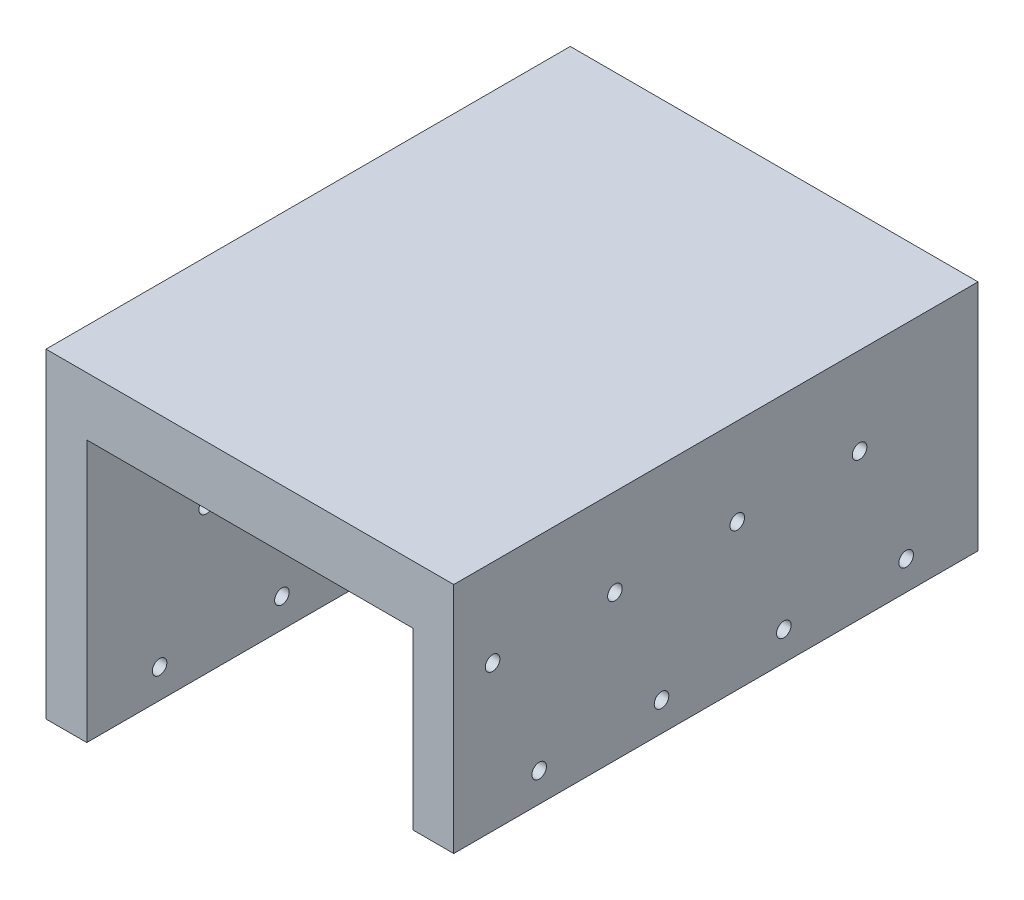
ISO-10303-21;
HEADER;
FILE_DESCRIPTION(('STEP AP214'),'2;1');
FILE_NAME('part.step','',(''),(''),'','','');
FILE_SCHEMA(('AUTOMOTIVE_DESIGN { 1 0 10303 214 1 1 1 1 }'));
ENDSEC;
DATA;
#1=APPLICATION_CONTEXT('core data for automotive mechanical design processes');
#2=APPLICATION_PROTOCOL_DEFINITION('international standard','automotive_design',2000,#1);
#3=PRODUCT_CONTEXT('',#1,'mechanical');
#4=PRODUCT('Part','Part','',(#3));
#5=PRODUCT_RELATED_PRODUCT_CATEGORY('part','',(#4));
#6=PRODUCT_DEFINITION_FORMATION('','',#4);
#7=PRODUCT_DEFINITION_CONTEXT('part definition',#1,'design');
#8=PRODUCT_DEFINITION('design','',#6,#7);
#9=PRODUCT_DEFINITION_SHAPE('','',#8);
#10=(LENGTH_UNIT() NAMED_UNIT(*) SI_UNIT(.MILLI.,.METRE.));
#11=(NAMED_UNIT(*) PLANE_ANGLE_UNIT() SI_UNIT($,.RADIAN.));
#12=(NAMED_UNIT(*) SI_UNIT($,.STERADIAN.) SOLID_ANGLE_UNIT());
#13=UNCERTAINTY_MEASURE_WITH_UNIT(LENGTH_MEASURE(1.E-05),#10,'distance_accuracy_value','');
#14=(GEOMETRIC_REPRESENTATION_CONTEXT(3) GLOBAL_UNCERTAINTY_ASSIGNED_CONTEXT((#13)) GLOBAL_UNIT_ASSIGNED_CONTEXT((#10,
#11,#12)) REPRESENTATION_CONTEXT('',''));
#15=CARTESIAN_POINT('',(0.,0.,0.));
#16=DIRECTION('',(0.,0.,1.));
#17=DIRECTION('',(1.,0.,0.));
#18=AXIS2_PLACEMENT_3D('',#15,#16,#17);
#19=CARTESIAN_POINT('',(0.,0.,90.));
#20=DIRECTION('',(1.,0.,0.));
#21=DIRECTION('',(0.,1.,0.));
#22=AXIS2_PLACEMENT_3D('',#19,#20,#21);
#23=PLANE('',#22);
#24=CARTESIAN_POINT('',(0.,25.,6.50000000000001));
#25=DIRECTION('',(-1.,0.,0.));
#26=DIRECTION('',(0.,-1.,0.));
#27=AXIS2_PLACEMENT_3D('',#24,#25,#26);
#28=CIRCLE('',#27,1.25);
#29=CARTESIAN_POINT('',(0.,23.75,6.50000000000001));
#30=VERTEX_POINT('',#29);
#31=EDGE_CURVE('E273',#30,#30,#28,.T.);
#32=ORIENTED_EDGE('',*,*,#31,.F.);
#33=EDGE_LOOP('',(#32));
#34=FACE_BOUND('',#33,.T.);
#35=CARTESIAN_POINT('',(0.,5.,14.5));
#36=DIRECTION('',(-1.,0.,0.));
#37=DIRECTION('',(0.,-1.,0.));
#38=AXIS2_PLACEMENT_3D('',#35,#36,#37);
#39=CIRCLE('',#38,1.25);
#40=CARTESIAN_POINT('',(0.,3.75,14.5));
#41=VERTEX_POINT('',#40);
#42=EDGE_CURVE('E269',#41,#41,#39,.T.);
#43=ORIENTED_EDGE('',*,*,#42,.F.);
#44=EDGE_LOOP('',(#43));
#45=FACE_BOUND('',#44,.T.);
#46=CARTESIAN_POINT('',(0.,25.,27.5));
#47=DIRECTION('',(-1.,0.,0.));
#48=DIRECTION('',(0.,-1.,0.));
#49=AXIS2_PLACEMENT_3D('',#46,#47,#48);
#50=CIRCLE('',#49,1.25);
#51=CARTESIAN_POINT('',(0.,23.75,27.5));
#52=VERTEX_POINT('',#51);
#53=EDGE_CURVE('E261',#52,#52,#50,.T.);
#54=ORIENTED_EDGE('',*,*,#53,.F.);
#55=EDGE_LOOP('',(#54));
#56=FACE_BOUND('',#55,.T.);
#57=CARTESIAN_POINT('',(0.,5.,35.5));
#58=DIRECTION('',(-1.,0.,0.));
#59=DIRECTION('',(0.,-1.,0.));
#60=AXIS2_PLACEMENT_3D('',#57,#58,#59);
#61=CIRCLE('',#60,1.25000000000001);
#62=CARTESIAN_POINT('',(0.,3.74999999999999,35.5));
#63=VERTEX_POINT('',#62);
#64=EDGE_CURVE('E253',#63,#63,#61,.T.);
#65=ORIENTED_EDGE('',*,*,#64,.F.);
#66=EDGE_LOOP('',(#65));
#67=FACE_BOUND('',#66,.T.);
#68=CARTESIAN_POINT('',(0.,25.,48.5));
#69=DIRECTION('',(-1.,0.,0.));
#70=DIRECTION('',(0.,-1.,0.));
#71=AXIS2_PLACEMENT_3D('',#68,#69,#70);
#72=CIRCLE('',#71,1.25);
#73=CARTESIAN_POINT('',(0.,23.75,48.5));
#74=VERTEX_POINT('',#73);
#75=EDGE_CURVE('E245',#74,#74,#72,.T.);
#76=ORIENTED_EDGE('',*,*,#75,.F.);
#77=EDGE_LOOP('',(#76));
#78=FACE_BOUND('',#77,.T.);
#79=CARTESIAN_POINT('',(0.,5.,56.5));
#80=DIRECTION('',(-1.,0.,0.));
#81=DIRECTION('',(0.,-1.,0.));
#82=AXIS2_PLACEMENT_3D('',#79,#80,#81);
#83=CIRCLE('',#82,1.25000000000001);
#84=CARTESIAN_POINT('',(0.,3.74999999999999,56.5));
#85=VERTEX_POINT('',#84);
#86=EDGE_CURVE('E237',#85,#85,#83,.T.);
#87=ORIENTED_EDGE('',*,*,#86,.F.);
#88=EDGE_LOOP('',(#87));
#89=FACE_BOUND('',#88,.T.);
#90=CARTESIAN_POINT('',(0.,25.,69.5));
#91=DIRECTION('',(-1.,0.,0.));
#92=DIRECTION('',(0.,-1.,0.));
#93=AXIS2_PLACEMENT_3D('',#90,#91,#92);
#94=CIRCLE('',#93,1.25);
#95=CARTESIAN_POINT('',(0.,23.75,69.5));
#96=VERTEX_POINT('',#95);
#97=EDGE_CURVE('E229',#96,#96,#94,.T.);
#98=ORIENTED_EDGE('',*,*,#97,.F.);
#99=EDGE_LOOP('',(#98));
#100=FACE_BOUND('',#99,.T.);
#101=CARTESIAN_POINT('',(0.,5.,77.5));
#102=DIRECTION('',(-1.,0.,0.));
#103=DIRECTION('',(0.,-1.,0.));
#104=AXIS2_PLACEMENT_3D('',#101,#102,#103);
#105=CIRCLE('',#104,1.25000000000001);
#106=CARTESIAN_POINT('',(0.,3.74999999999999,77.5));
#107=VERTEX_POINT('',#106);
#108=EDGE_CURVE('E219',#107,#107,#105,.T.);
#109=ORIENTED_EDGE('',*,*,#108,.F.);
#110=EDGE_LOOP('',(#109));
#111=FACE_BOUND('',#110,.T.);
#112=DIRECTION('',(0.,-1.,0.));
#113=VECTOR('',#112,1.);
#114=CARTESIAN_POINT('',(0.,0.,0.));
#115=LINE('',#114,#113);
#116=CARTESIAN_POINT('',(0.,55.,0.));
#117=VERTEX_POINT('',#116);
#118=CARTESIAN_POINT('',(0.,0.,0.));
#119=VERTEX_POINT('',#118);
#120=EDGE_CURVE('E153',#117,#119,#115,.T.);
#121=ORIENTED_EDGE('',*,*,#120,.T.);
#122=DIRECTION('',(0.,0.,-1.));
#123=VECTOR('',#122,1.);
#124=CARTESIAN_POINT('',(0.,0.,90.));
#125=LINE('',#124,#123);
#126=CARTESIAN_POINT('',(0.,0.,90.));
#127=VERTEX_POINT('',#126);
#128=EDGE_CURVE('E11',#127,#119,#125,.T.);
#129=ORIENTED_EDGE('',*,*,#128,.F.);
#130=DIRECTION('',(0.,-1.,0.));
#131=VECTOR('',#130,1.);
#132=CARTESIAN_POINT('',(0.,0.,90.));
#133=LINE('',#132,#131);
#134=CARTESIAN_POINT('',(0.,55.,90.));
#135=VERTEX_POINT('',#134);
#136=EDGE_CURVE('E150',#135,#127,#133,.T.);
#137=ORIENTED_EDGE('',*,*,#136,.F.);
#138=DIRECTION('',(0.,0.,-1.));
#139=VECTOR('',#138,1.);
#140=CARTESIAN_POINT('',(0.,55.,90.));
#141=LINE('',#140,#139);
#142=EDGE_CURVE('E157',#135,#117,#141,.T.);
#143=ORIENTED_EDGE('',*,*,#142,.T.);
#144=EDGE_LOOP('',(#121,#129,#137,#143));
#145=FACE_BOUND('',#144,.T.);
#146=ADVANCED_FACE('F47',(#34,#45,#56,#67,#78,#89,#100,#111,#145),#23,.F.);
#147=CARTESIAN_POINT('',(0.,0.,90.));
#148=DIRECTION('',(0.,1.,0.));
#149=DIRECTION('',(0.,0.,1.));
#150=AXIS2_PLACEMENT_3D('',#147,#148,#149);
#151=PLANE('',#150);
#152=DIRECTION('',(1.,0.,0.));
#153=VECTOR('',#152,1.);
#154=CARTESIAN_POINT('',(0.,0.,0.));
#155=LINE('',#154,#153);
#156=CARTESIAN_POINT('',(6.99999999999997,0.,0.));
#157=VERTEX_POINT('',#156);
#158=EDGE_CURVE('E146',#119,#157,#155,.T.);
#159=ORIENTED_EDGE('',*,*,#158,.T.);
#160=DIRECTION('',(0.,0.,1.));
#161=VECTOR('',#160,1.);
#162=CARTESIAN_POINT('',(6.99999999999997,0.,0.));
#163=LINE('',#162,#161);
#164=CARTESIAN_POINT('',(6.99999999999997,0.,90.));
#165=VERTEX_POINT('',#164);
#166=EDGE_CURVE('E186',#157,#165,#163,.T.);
#167=ORIENTED_EDGE('',*,*,#166,.T.);
#168=DIRECTION('',(1.,0.,0.));
#169=VECTOR('',#168,1.);
#170=CARTESIAN_POINT('',(0.,0.,90.));
#171=LINE('',#170,#169);
#172=EDGE_CURVE('E94',#127,#165,#171,.T.);
#173=ORIENTED_EDGE('',*,*,#172,.F.);
#174=ORIENTED_EDGE('',*,*,#128,.T.);
#175=EDGE_LOOP('',(#159,#167,#173,#174));
#176=FACE_BOUND('',#175,.T.);
#177=ADVANCED_FACE('F185',(#176),#151,.F.);
#178=CARTESIAN_POINT('',(70.,0.,90.));
#179=DIRECTION('',(-1.,0.,0.));
#180=DIRECTION('',(0.,-1.,0.));
#181=AXIS2_PLACEMENT_3D('',#178,#179,#180);
#182=PLANE('',#181);
#183=CARTESIAN_POINT('',(70.,40.,83.3317645611481));
#184=DIRECTION('',(1.,0.,0.));
#185=DIRECTION('',(0.,1.,0.));
#186=AXIS2_PLACEMENT_3D('',#183,#184,#185);
#187=CIRCLE('',#186,1.25);
#188=CARTESIAN_POINT('',(70.,41.25,83.3317645611481));
#189=VERTEX_POINT('',#188);
#190=EDGE_CURVE('E336',#189,#189,#187,.T.);
#191=ORIENTED_EDGE('',*,*,#190,.F.);
#192=EDGE_LOOP('',(#191));
#193=FACE_BOUND('',#192,.T.);
#194=CARTESIAN_POINT('',(70.,20.,75.3317645611481));
#195=DIRECTION('',(1.,0.,0.));
#196=DIRECTION('',(0.,1.,0.));
#197=AXIS2_PLACEMENT_3D('',#194,#195,#196);
#198=CIRCLE('',#197,1.25);
#199=CARTESIAN_POINT('',(70.,21.25,75.3317645611481));
#200=VERTEX_POINT('',#199);
#201=EDGE_CURVE('E332',#200,#200,#198,.T.);
#202=ORIENTED_EDGE('',*,*,#201,.F.);
#203=EDGE_LOOP('',(#202));
#204=FACE_BOUND('',#203,.T.);
#205=CARTESIAN_POINT('',(70.,40.,62.3317645611481));
#206=DIRECTION('',(1.,0.,0.));
#207=DIRECTION('',(0.,1.,0.));
#208=AXIS2_PLACEMENT_3D('',#205,#206,#207);
#209=CIRCLE('',#208,1.25);
#210=CARTESIAN_POINT('',(70.,41.25,62.3317645611481));
#211=VERTEX_POINT('',#210);
#212=EDGE_CURVE('E324',#211,#211,#209,.T.);
#213=ORIENTED_EDGE('',*,*,#212,.F.);
#214=EDGE_LOOP('',(#213));
#215=FACE_BOUND('',#214,.T.);
#216=CARTESIAN_POINT('',(70.,20.,54.3317645611481));
#217=DIRECTION('',(1.,0.,0.));
#218=DIRECTION('',(0.,1.,0.));
#219=AXIS2_PLACEMENT_3D('',#216,#217,#218);
#220=CIRCLE('',#219,1.25000000000001);
#221=CARTESIAN_POINT('',(70.,21.25,54.3317645611481));
#222=VERTEX_POINT('',#221);
#223=EDGE_CURVE('E316',#222,#222,#220,.T.);
#224=ORIENTED_EDGE('',*,*,#223,.F.);
#225=EDGE_LOOP('',(#224));
#226=FACE_BOUND('',#225,.T.);
#227=CARTESIAN_POINT('',(70.,40.,41.3317645611481));
#228=DIRECTION('',(1.,0.,0.));
#229=DIRECTION('',(0.,1.,0.));
#230=AXIS2_PLACEMENT_3D('',#227,#228,#229);
#231=CIRCLE('',#230,1.25);
#232=CARTESIAN_POINT('',(70.,41.25,41.3317645611481));
#233=VERTEX_POINT('',#232);
#234=EDGE_CURVE('E308',#233,#233,#231,.T.);
#235=ORIENTED_EDGE('',*,*,#234,.F.);
#236=EDGE_LOOP('',(#235));
#237=FACE_BOUND('',#236,.T.);
#238=CARTESIAN_POINT('',(70.,20.,33.3317645611481));
#239=DIRECTION('',(1.,0.,0.));
#240=DIRECTION('',(0.,1.,0.));
#241=AXIS2_PLACEMENT_3D('',#238,#239,#240);
#242=CIRCLE('',#241,1.25000000000001);
#243=CARTESIAN_POINT('',(70.,21.25,33.3317645611481));
#244=VERTEX_POINT('',#243);
#245=EDGE_CURVE('E300',#244,#244,#242,.T.);
#246=ORIENTED_EDGE('',*,*,#245,.F.);
#247=EDGE_LOOP('',(#246));
#248=FACE_BOUND('',#247,.T.);
#249=CARTESIAN_POINT('',(70.,40.,20.3317645611481));
#250=DIRECTION('',(1.,0.,0.));
#251=DIRECTION('',(0.,1.,0.));
#252=AXIS2_PLACEMENT_3D('',#249,#250,#251);
#253=CIRCLE('',#252,1.25);
#254=CARTESIAN_POINT('',(70.,41.25,20.3317645611481));
#255=VERTEX_POINT('',#254);
#256=EDGE_CURVE('E292',#255,#255,#253,.T.);
#257=ORIENTED_EDGE('',*,*,#256,.F.);
#258=EDGE_LOOP('',(#257));
#259=FACE_BOUND('',#258,.T.);
#260=CARTESIAN_POINT('',(70.,20.,12.3317645611481));
#261=DIRECTION('',(1.,0.,0.));
#262=DIRECTION('',(0.,1.,0.));
#263=AXIS2_PLACEMENT_3D('',#260,#261,#262);
#264=CIRCLE('',#263,1.25000000000001);
#265=CARTESIAN_POINT('',(70.,21.25,12.3317645611481));
#266=VERTEX_POINT('',#265);
#267=EDGE_CURVE('E283',#266,#266,#264,.T.);
#268=ORIENTED_EDGE('',*,*,#267,.F.);
#269=EDGE_LOOP('',(#268));
#270=FACE_BOUND('',#269,.T.);
#271=DIRECTION('',(0.,1.,0.));
#272=VECTOR('',#271,1.);
#273=CARTESIAN_POINT('',(70.,0.,90.));
#274=LINE('',#273,#272);
#275=CARTESIAN_POINT('',(70.,15.,90.));
#276=VERTEX_POINT('',#275);
#277=CARTESIAN_POINT('',(70.,55.,90.));
#278=VERTEX_POINT('',#277);
#279=EDGE_CURVE('E138',#276,#278,#274,.T.);
#280=ORIENTED_EDGE('',*,*,#279,.F.);
#281=DIRECTION('',(0.,0.,1.));
#282=VECTOR('',#281,1.);
#283=CARTESIAN_POINT('',(70.,15.,0.));
#284=LINE('',#283,#282);
#285=CARTESIAN_POINT('',(70.,15.,0.));
#286=VERTEX_POINT('',#285);
#287=EDGE_CURVE('E125',#286,#276,#284,.T.);
#288=ORIENTED_EDGE('',*,*,#287,.F.);
#289=DIRECTION('',(0.,1.,0.));
#290=VECTOR('',#289,1.);
#291=CARTESIAN_POINT('',(70.,0.,0.));
#292=LINE('',#291,#290);
#293=CARTESIAN_POINT('',(70.,55.,0.));
#294=VERTEX_POINT('',#293);
#295=EDGE_CURVE('E137',#286,#294,#292,.T.);
#296=ORIENTED_EDGE('',*,*,#295,.T.);
#297=DIRECTION('',(0.,0.,-1.));
#298=VECTOR('',#297,1.);
#299=CARTESIAN_POINT('',(70.,55.,90.));
#300=LINE('',#299,#298);
#301=EDGE_CURVE('E55',#278,#294,#300,.T.);
#302=ORIENTED_EDGE('',*,*,#301,.F.);
#303=EDGE_LOOP('',(#280,#288,#296,#302));
#304=FACE_BOUND('',#303,.T.);
#305=ADVANCED_FACE('F135',(#193,#204,#215,#226,#237,#248,#259,#270,#304),#182,.F.);
#306=CARTESIAN_POINT('',(0.,55.,90.));
#307=DIRECTION('',(0.,-1.,0.));
#308=DIRECTION('',(0.,0.,-1.));
#309=AXIS2_PLACEMENT_3D('',#306,#307,#308);
#310=PLANE('',#309);
#311=DIRECTION('',(-1.,0.,0.));
#312=VECTOR('',#311,1.);
#313=CARTESIAN_POINT('',(0.,55.,0.));
#314=LINE('',#313,#312);
#315=EDGE_CURVE('E88',#294,#117,#314,.T.);
#316=ORIENTED_EDGE('',*,*,#315,.T.);
#317=ORIENTED_EDGE('',*,*,#142,.F.);
#318=DIRECTION('',(-1.,0.,0.));
#319=VECTOR('',#318,1.);
#320=CARTESIAN_POINT('',(0.,55.,90.));
#321=LINE('',#320,#319);
#322=EDGE_CURVE('E71',#278,#135,#321,.T.);
#323=ORIENTED_EDGE('',*,*,#322,.F.);
#324=ORIENTED_EDGE('',*,*,#301,.T.);
#325=EDGE_LOOP('',(#316,#317,#323,#324));
#326=FACE_BOUND('',#325,.T.);
#327=ADVANCED_FACE('F160',(#326),#310,.F.);
#328=CARTESIAN_POINT('',(0.,0.,90.));
#329=DIRECTION('',(0.,0.,-1.));
#330=DIRECTION('',(-1.,0.,0.));
#331=AXIS2_PLACEMENT_3D('',#328,#329,#330);
#332=PLANE('',#331);
#333=ORIENTED_EDGE('',*,*,#172,.T.);
#334=DIRECTION('',(0.,1.,0.));
#335=VECTOR('',#334,1.);
#336=CARTESIAN_POINT('',(6.99999999999997,0.,90.));
#337=LINE('',#336,#335);
#338=CARTESIAN_POINT('',(6.99999999999997,45.,90.));
#339=VERTEX_POINT('',#338);
#340=EDGE_CURVE('E169',#165,#339,#337,.T.);
#341=ORIENTED_EDGE('',*,*,#340,.T.);
#342=DIRECTION('',(1.,0.,0.));
#343=VECTOR('',#342,1.);
#344=CARTESIAN_POINT('',(0.,45.,90.));
#345=LINE('',#344,#343);
#346=CARTESIAN_POINT('',(63.,45.,90.));
#347=VERTEX_POINT('',#346);
#348=EDGE_CURVE('E174',#339,#347,#345,.T.);
#349=ORIENTED_EDGE('',*,*,#348,.T.);
#350=DIRECTION('',(0.,-1.,0.));
#351=VECTOR('',#350,1.);
#352=CARTESIAN_POINT('',(63.,0.,90.));
#353=LINE('',#352,#351);
#354=CARTESIAN_POINT('',(63.,15.,90.));
#355=VERTEX_POINT('',#354);
#356=EDGE_CURVE('E178',#347,#355,#353,.T.);
#357=ORIENTED_EDGE('',*,*,#356,.T.);
#358=DIRECTION('',(1.,0.,0.));
#359=VECTOR('',#358,1.);
#360=CARTESIAN_POINT('',(0.,15.,90.));
#361=LINE('',#360,#359);
#362=EDGE_CURVE('E201',#355,#276,#361,.T.);
#363=ORIENTED_EDGE('',*,*,#362,.T.);
#364=ORIENTED_EDGE('',*,*,#279,.T.);
#365=ORIENTED_EDGE('',*,*,#322,.T.);
#366=ORIENTED_EDGE('',*,*,#136,.T.);
#367=EDGE_LOOP('',(#333,#341,#349,#357,#363,#364,#365,#366));
#368=FACE_BOUND('',#367,.T.);
#369=ADVANCED_FACE('F184',(#368),#332,.F.);
#370=CARTESIAN_POINT('',(0.,0.,0.));
#371=DIRECTION('',(0.,0.,-1.));
#372=DIRECTION('',(-1.,0.,0.));
#373=AXIS2_PLACEMENT_3D('',#370,#371,#372);
#374=PLANE('',#373);
#375=DIRECTION('',(0.,-1.,0.));
#376=VECTOR('',#375,1.);
#377=CARTESIAN_POINT('',(6.99999999999997,0.,0.));
#378=LINE('',#377,#376);
#379=CARTESIAN_POINT('',(6.99999999999997,45.,0.));
#380=VERTEX_POINT('',#379);
#381=EDGE_CURVE('E140',#380,#157,#378,.T.);
#382=ORIENTED_EDGE('',*,*,#381,.T.);
#383=ORIENTED_EDGE('',*,*,#158,.F.);
#384=ORIENTED_EDGE('',*,*,#120,.F.);
#385=ORIENTED_EDGE('',*,*,#315,.F.);
#386=ORIENTED_EDGE('',*,*,#295,.F.);
#387=DIRECTION('',(-1.,0.,0.));
#388=VECTOR('',#387,1.);
#389=CARTESIAN_POINT('',(63.,15.,0.));
#390=LINE('',#389,#388);
#391=CARTESIAN_POINT('',(63.,15.,0.));
#392=VERTEX_POINT('',#391);
#393=EDGE_CURVE('E122',#286,#392,#390,.T.);
#394=ORIENTED_EDGE('',*,*,#393,.T.);
#395=DIRECTION('',(0.,1.,0.));
#396=VECTOR('',#395,1.);
#397=CARTESIAN_POINT('',(63.,45.,0.));
#398=LINE('',#397,#396);
#399=CARTESIAN_POINT('',(63.,45.,0.));
#400=VERTEX_POINT('',#399);
#401=EDGE_CURVE('E62',#392,#400,#398,.T.);
#402=ORIENTED_EDGE('',*,*,#401,.T.);
#403=DIRECTION('',(-1.,0.,0.));
#404=VECTOR('',#403,1.);
#405=CARTESIAN_POINT('',(6.99999999999997,45.,0.));
#406=LINE('',#405,#404);
#407=EDGE_CURVE('E190',#400,#380,#406,.T.);
#408=ORIENTED_EDGE('',*,*,#407,.T.);
#409=EDGE_LOOP('',(#382,#383,#384,#385,#386,#394,#402,#408));
#410=FACE_BOUND('',#409,.T.);
#411=ADVANCED_FACE('F143',(#410),#374,.T.);
#412=CARTESIAN_POINT('',(6.99999999999997,0.,0.));
#413=DIRECTION('',(-1.,0.,0.));
#414=DIRECTION('',(0.,0.,1.));
#415=AXIS2_PLACEMENT_3D('',#412,#413,#414);
#416=PLANE('',#415);
#417=CARTESIAN_POINT('',(6.99999999999997,25.,6.50000000000001));
#418=DIRECTION('',(-1.,0.,0.));
#419=DIRECTION('',(0.,0.,1.));
#420=AXIS2_PLACEMENT_3D('',#417,#418,#419);
#421=CIRCLE('',#420,1.25);
#422=CARTESIAN_POINT('',(6.99999999999997,25.,7.75000000000001));
#423=VERTEX_POINT('',#422);
#424=EDGE_CURVE('E131',#423,#423,#421,.F.);
#425=ORIENTED_EDGE('',*,*,#424,.F.);
#426=EDGE_LOOP('',(#425));
#427=FACE_BOUND('',#426,.T.);
#428=CARTESIAN_POINT('',(6.99999999999997,5.,14.5));
#429=DIRECTION('',(-1.,0.,0.));
#430=DIRECTION('',(0.,0.,1.));
#431=AXIS2_PLACEMENT_3D('',#428,#429,#430);
#432=CIRCLE('',#431,1.25);
#433=CARTESIAN_POINT('',(6.99999999999997,5.,15.75));
#434=VERTEX_POINT('',#433);
#435=EDGE_CURVE('E265',#434,#434,#432,.F.);
#436=ORIENTED_EDGE('',*,*,#435,.F.);
#437=EDGE_LOOP('',(#436));
#438=FACE_BOUND('',#437,.T.);
#439=CARTESIAN_POINT('',(6.99999999999997,25.,27.5));
#440=DIRECTION('',(-1.,0.,0.));
#441=DIRECTION('',(0.,0.,1.));
#442=AXIS2_PLACEMENT_3D('',#439,#440,#441);
#443=CIRCLE('',#442,1.25);
#444=CARTESIAN_POINT('',(6.99999999999997,25.,28.75));
#445=VERTEX_POINT('',#444);
#446=EDGE_CURVE('E257',#445,#445,#443,.F.);
#447=ORIENTED_EDGE('',*,*,#446,.F.);
#448=EDGE_LOOP('',(#447));
#449=FACE_BOUND('',#448,.T.);
#450=CARTESIAN_POINT('',(6.99999999999997,5.,35.5));
#451=DIRECTION('',(-1.,0.,0.));
#452=DIRECTION('',(0.,0.,1.));
#453=AXIS2_PLACEMENT_3D('',#450,#451,#452);
#454=CIRCLE('',#453,1.25000000000001);
#455=CARTESIAN_POINT('',(6.99999999999997,5.,36.75));
#456=VERTEX_POINT('',#455);
#457=EDGE_CURVE('E249',#456,#456,#454,.F.);
#458=ORIENTED_EDGE('',*,*,#457,.F.);
#459=EDGE_LOOP('',(#458));
#460=FACE_BOUND('',#459,.T.);
#461=CARTESIAN_POINT('',(6.99999999999997,25.,48.5));
#462=DIRECTION('',(-1.,0.,0.));
#463=DIRECTION('',(0.,0.,1.));
#464=AXIS2_PLACEMENT_3D('',#461,#462,#463);
#465=CIRCLE('',#464,1.25);
#466=CARTESIAN_POINT('',(6.99999999999997,25.,49.75));
#467=VERTEX_POINT('',#466);
#468=EDGE_CURVE('E241',#467,#467,#465,.F.);
#469=ORIENTED_EDGE('',*,*,#468,.F.);
#470=EDGE_LOOP('',(#469));
#471=FACE_BOUND('',#470,.T.);
#472=CARTESIAN_POINT('',(6.99999999999997,5.,56.5));
#473=DIRECTION('',(-1.,0.,0.));
#474=DIRECTION('',(0.,0.,1.));
#475=AXIS2_PLACEMENT_3D('',#472,#473,#474);
#476=CIRCLE('',#475,1.25000000000001);
#477=CARTESIAN_POINT('',(6.99999999999997,5.,57.75));
#478=VERTEX_POINT('',#477);
#479=EDGE_CURVE('E233',#478,#478,#476,.F.);
#480=ORIENTED_EDGE('',*,*,#479,.F.);
#481=EDGE_LOOP('',(#480));
#482=FACE_BOUND('',#481,.T.);
#483=CARTESIAN_POINT('',(6.99999999999997,25.,69.5));
#484=DIRECTION('',(-1.,0.,0.));
#485=DIRECTION('',(0.,0.,1.));
#486=AXIS2_PLACEMENT_3D('',#483,#484,#485);
#487=CIRCLE('',#486,1.25);
#488=CARTESIAN_POINT('',(6.99999999999997,25.,70.75));
#489=VERTEX_POINT('',#488);
#490=EDGE_CURVE('E223',#489,#489,#487,.F.);
#491=ORIENTED_EDGE('',*,*,#490,.F.);
#492=EDGE_LOOP('',(#491));
#493=FACE_BOUND('',#492,.T.);
#494=CARTESIAN_POINT('',(6.99999999999997,5.,77.5));
#495=DIRECTION('',(-1.,0.,0.));
#496=DIRECTION('',(0.,0.,1.));
#497=AXIS2_PLACEMENT_3D('',#494,#495,#496);
#498=CIRCLE('',#497,1.25000000000001);
#499=CARTESIAN_POINT('',(6.99999999999997,5.,78.75));
#500=VERTEX_POINT('',#499);
#501=EDGE_CURVE('E224',#500,#500,#498,.F.);
#502=ORIENTED_EDGE('',*,*,#501,.F.);
#503=EDGE_LOOP('',(#502));
#504=FACE_BOUND('',#503,.T.);
#505=ORIENTED_EDGE('',*,*,#166,.F.);
#506=ORIENTED_EDGE('',*,*,#381,.F.);
#507=DIRECTION('',(0.,0.,1.));
#508=VECTOR('',#507,1.);
#509=CARTESIAN_POINT('',(6.99999999999997,45.,0.));
#510=LINE('',#509,#508);
#511=EDGE_CURVE('E202',#380,#339,#510,.T.);
#512=ORIENTED_EDGE('',*,*,#511,.T.);
#513=ORIENTED_EDGE('',*,*,#340,.F.);
#514=EDGE_LOOP('',(#505,#506,#512,#513));
#515=FACE_BOUND('',#514,.T.);
#516=ADVANCED_FACE('F420',(#427,#438,#449,#460,#471,#482,#493,#504,#515),#416,.F.);
#517=CARTESIAN_POINT('',(6.99999999999997,45.,0.));
#518=DIRECTION('',(0.,1.,0.));
#519=DIRECTION('',(0.,0.,1.));
#520=AXIS2_PLACEMENT_3D('',#517,#518,#519);
#521=PLANE('',#520);
#522=ORIENTED_EDGE('',*,*,#511,.F.);
#523=ORIENTED_EDGE('',*,*,#407,.F.);
#524=DIRECTION('',(0.,0.,1.));
#525=VECTOR('',#524,1.);
#526=CARTESIAN_POINT('',(63.,45.,0.));
#527=LINE('',#526,#525);
#528=EDGE_CURVE('E205',#400,#347,#527,.T.);
#529=ORIENTED_EDGE('',*,*,#528,.T.);
#530=ORIENTED_EDGE('',*,*,#348,.F.);
#531=EDGE_LOOP('',(#522,#523,#529,#530));
#532=FACE_BOUND('',#531,.T.);
#533=ADVANCED_FACE('F216',(#532),#521,.F.);
#534=CARTESIAN_POINT('',(63.,45.,0.));
#535=DIRECTION('',(1.,0.,0.));
#536=DIRECTION('',(0.,0.,-1.));
#537=AXIS2_PLACEMENT_3D('',#534,#535,#536);
#538=PLANE('',#537);
#539=CARTESIAN_POINT('',(63.,40.,83.3317645611481));
#540=DIRECTION('',(1.,0.,0.));
#541=DIRECTION('',(0.,0.,-1.));
#542=AXIS2_PLACEMENT_3D('',#539,#540,#541);
#543=CIRCLE('',#542,1.25);
#544=CARTESIAN_POINT('',(63.,40.,82.0817645611481));
#545=VERTEX_POINT('',#544);
#546=EDGE_CURVE('E228',#545,#545,#543,.F.);
#547=ORIENTED_EDGE('',*,*,#546,.F.);
#548=EDGE_LOOP('',(#547));
#549=FACE_BOUND('',#548,.T.);
#550=CARTESIAN_POINT('',(63.,20.,75.3317645611481));
#551=DIRECTION('',(1.,0.,0.));
#552=DIRECTION('',(0.,0.,-1.));
#553=AXIS2_PLACEMENT_3D('',#550,#551,#552);
#554=CIRCLE('',#553,1.25);
#555=CARTESIAN_POINT('',(63.,20.,74.0817645611481));
#556=VERTEX_POINT('',#555);
#557=EDGE_CURVE('E328',#556,#556,#554,.F.);
#558=ORIENTED_EDGE('',*,*,#557,.F.);
#559=EDGE_LOOP('',(#558));
#560=FACE_BOUND('',#559,.T.);
#561=CARTESIAN_POINT('',(63.,40.,62.3317645611481));
#562=DIRECTION('',(1.,0.,0.));
#563=DIRECTION('',(0.,0.,-1.));
#564=AXIS2_PLACEMENT_3D('',#561,#562,#563);
#565=CIRCLE('',#564,1.25);
#566=CARTESIAN_POINT('',(63.,40.,61.0817645611481));
#567=VERTEX_POINT('',#566);
#568=EDGE_CURVE('E320',#567,#567,#565,.F.);
#569=ORIENTED_EDGE('',*,*,#568,.F.);
#570=EDGE_LOOP('',(#569));
#571=FACE_BOUND('',#570,.T.);
#572=CARTESIAN_POINT('',(63.,20.,54.3317645611481));
#573=DIRECTION('',(1.,0.,0.));
#574=DIRECTION('',(0.,0.,-1.));
#575=AXIS2_PLACEMENT_3D('',#572,#573,#574);
#576=CIRCLE('',#575,1.25000000000001);
#577=CARTESIAN_POINT('',(63.,20.,53.0817645611481));
#578=VERTEX_POINT('',#577);
#579=EDGE_CURVE('E312',#578,#578,#576,.F.);
#580=ORIENTED_EDGE('',*,*,#579,.F.);
#581=EDGE_LOOP('',(#580));
#582=FACE_BOUND('',#581,.T.);
#583=CARTESIAN_POINT('',(63.,40.,41.3317645611481));
#584=DIRECTION('',(1.,0.,0.));
#585=DIRECTION('',(0.,0.,-1.));
#586=AXIS2_PLACEMENT_3D('',#583,#584,#585);
#587=CIRCLE('',#586,1.25);
#588=CARTESIAN_POINT('',(63.,40.,40.0817645611481));
#589=VERTEX_POINT('',#588);
#590=EDGE_CURVE('E304',#589,#589,#587,.F.);
#591=ORIENTED_EDGE('',*,*,#590,.F.);
#592=EDGE_LOOP('',(#591));
#593=FACE_BOUND('',#592,.T.);
#594=CARTESIAN_POINT('',(63.,20.,33.3317645611481));
#595=DIRECTION('',(1.,0.,0.));
#596=DIRECTION('',(0.,0.,-1.));
#597=AXIS2_PLACEMENT_3D('',#594,#595,#596);
#598=CIRCLE('',#597,1.25000000000001);
#599=CARTESIAN_POINT('',(63.,20.,32.0817645611481));
#600=VERTEX_POINT('',#599);
#601=EDGE_CURVE('E296',#600,#600,#598,.F.);
#602=ORIENTED_EDGE('',*,*,#601,.F.);
#603=EDGE_LOOP('',(#602));
#604=FACE_BOUND('',#603,.T.);
#605=CARTESIAN_POINT('',(63.,40.,20.3317645611481));
#606=DIRECTION('',(1.,0.,0.));
#607=DIRECTION('',(0.,0.,-1.));
#608=AXIS2_PLACEMENT_3D('',#605,#606,#607);
#609=CIRCLE('',#608,1.25);
#610=CARTESIAN_POINT('',(63.,40.,19.0817645611481));
#611=VERTEX_POINT('',#610);
#612=EDGE_CURVE('E287',#611,#611,#609,.F.);
#613=ORIENTED_EDGE('',*,*,#612,.F.);
#614=EDGE_LOOP('',(#613));
#615=FACE_BOUND('',#614,.T.);
#616=CARTESIAN_POINT('',(63.,20.,12.3317645611481));
#617=DIRECTION('',(1.,0.,0.));
#618=DIRECTION('',(0.,0.,-1.));
#619=AXIS2_PLACEMENT_3D('',#616,#617,#618);
#620=CIRCLE('',#619,1.25000000000001);
#621=CARTESIAN_POINT('',(63.,20.,11.0817645611481));
#622=VERTEX_POINT('',#621);
#623=EDGE_CURVE('E288',#622,#622,#620,.F.);
#624=ORIENTED_EDGE('',*,*,#623,.F.);
#625=EDGE_LOOP('',(#624));
#626=FACE_BOUND('',#625,.T.);
#627=ORIENTED_EDGE('',*,*,#528,.F.);
#628=ORIENTED_EDGE('',*,*,#401,.F.);
#629=DIRECTION('',(0.,0.,1.));
#630=VECTOR('',#629,1.);
#631=CARTESIAN_POINT('',(63.,15.,0.));
#632=LINE('',#631,#630);
#633=EDGE_CURVE('E127',#392,#355,#632,.T.);
#634=ORIENTED_EDGE('',*,*,#633,.T.);
#635=ORIENTED_EDGE('',*,*,#356,.F.);
#636=EDGE_LOOP('',(#627,#628,#634,#635));
#637=FACE_BOUND('',#636,.T.);
#638=ADVANCED_FACE('F214',(#549,#560,#571,#582,#593,#604,#615,#626,#637),#538,.F.);
#639=CARTESIAN_POINT('',(63.,15.,0.));
#640=DIRECTION('',(0.,1.,0.));
#641=DIRECTION('',(0.,0.,1.));
#642=AXIS2_PLACEMENT_3D('',#639,#640,#641);
#643=PLANE('',#642);
#644=ORIENTED_EDGE('',*,*,#633,.F.);
#645=ORIENTED_EDGE('',*,*,#393,.F.);
#646=ORIENTED_EDGE('',*,*,#287,.T.);
#647=ORIENTED_EDGE('',*,*,#362,.F.);
#648=EDGE_LOOP('',(#644,#645,#646,#647));
#649=FACE_BOUND('',#648,.T.);
#650=ADVANCED_FACE('F124',(#649),#643,.F.);
#651=CARTESIAN_POINT('',(10.5355339059327,5.00000000000001,77.5));
#652=DIRECTION('',(-1.,0.,0.));
#653=DIRECTION('',(0.,-1.,0.));
#654=AXIS2_PLACEMENT_3D('',#651,#652,#653);
#655=CYLINDRICAL_SURFACE('',#654,1.25000000000001);
#656=ORIENTED_EDGE('',*,*,#501,.T.);
#657=EDGE_LOOP('',(#656));
#658=FACE_BOUND('',#657,.T.);
#659=ORIENTED_EDGE('',*,*,#108,.T.);
#660=EDGE_LOOP('',(#659));
#661=FACE_BOUND('',#660,.T.);
#662=ADVANCED_FACE('F406',(#658,#661),#655,.F.);
#663=CARTESIAN_POINT('',(10.5355339059327,25.,69.5));
#664=DIRECTION('',(-1.,0.,0.));
#665=DIRECTION('',(0.,-1.,0.));
#666=AXIS2_PLACEMENT_3D('',#663,#664,#665);
#667=CYLINDRICAL_SURFACE('',#666,1.25);
#668=ORIENTED_EDGE('',*,*,#490,.T.);
#669=EDGE_LOOP('',(#668));
#670=FACE_BOUND('',#669,.T.);
#671=ORIENTED_EDGE('',*,*,#97,.T.);
#672=EDGE_LOOP('',(#671));
#673=FACE_BOUND('',#672,.T.);
#674=ADVANCED_FACE('F408',(#670,#673),#667,.F.);
#675=CARTESIAN_POINT('',(10.5355339059327,5.00000000000001,56.5));
#676=DIRECTION('',(-1.,0.,0.));
#677=DIRECTION('',(0.,-1.,0.));
#678=AXIS2_PLACEMENT_3D('',#675,#676,#677);
#679=CYLINDRICAL_SURFACE('',#678,1.25000000000001);
#680=ORIENTED_EDGE('',*,*,#479,.T.);
#681=EDGE_LOOP('',(#680));
#682=FACE_BOUND('',#681,.T.);
#683=ORIENTED_EDGE('',*,*,#86,.T.);
#684=EDGE_LOOP('',(#683));
#685=FACE_BOUND('',#684,.T.);
#686=ADVANCED_FACE('F414',(#682,#685),#679,.F.);
#687=CARTESIAN_POINT('',(10.5355339059327,25.,48.5));
#688=DIRECTION('',(-1.,0.,0.));
#689=DIRECTION('',(0.,-1.,0.));
#690=AXIS2_PLACEMENT_3D('',#687,#688,#689);
#691=CYLINDRICAL_SURFACE('',#690,1.25);
#692=ORIENTED_EDGE('',*,*,#468,.T.);
#693=EDGE_LOOP('',(#692));
#694=FACE_BOUND('',#693,.T.);
#695=ORIENTED_EDGE('',*,*,#75,.T.);
#696=EDGE_LOOP('',(#695));
#697=FACE_BOUND('',#696,.T.);
#698=ADVANCED_FACE('F485',(#694,#697),#691,.F.);
#699=CARTESIAN_POINT('',(10.5355339059327,5.00000000000001,35.5));
#700=DIRECTION('',(-1.,0.,0.));
#701=DIRECTION('',(0.,-1.,0.));
#702=AXIS2_PLACEMENT_3D('',#699,#700,#701);
#703=CYLINDRICAL_SURFACE('',#702,1.25000000000001);
#704=ORIENTED_EDGE('',*,*,#457,.T.);
#705=EDGE_LOOP('',(#704));
#706=FACE_BOUND('',#705,.T.);
#707=ORIENTED_EDGE('',*,*,#64,.T.);
#708=EDGE_LOOP('',(#707));
#709=FACE_BOUND('',#708,.T.);
#710=ADVANCED_FACE('F494',(#706,#709),#703,.F.);
#711=CARTESIAN_POINT('',(10.5355339059327,25.,27.5));
#712=DIRECTION('',(-1.,0.,0.));
#713=DIRECTION('',(0.,-1.,0.));
#714=AXIS2_PLACEMENT_3D('',#711,#712,#713);
#715=CYLINDRICAL_SURFACE('',#714,1.25);
#716=ORIENTED_EDGE('',*,*,#446,.T.);
#717=EDGE_LOOP('',(#716));
#718=FACE_BOUND('',#717,.T.);
#719=ORIENTED_EDGE('',*,*,#53,.T.);
#720=EDGE_LOOP('',(#719));
#721=FACE_BOUND('',#720,.T.);
#722=ADVANCED_FACE('F504',(#718,#721),#715,.F.);
#723=CARTESIAN_POINT('',(10.5355339059327,5.00000000000001,14.5));
#724=DIRECTION('',(-1.,0.,0.));
#725=DIRECTION('',(0.,-1.,0.));
#726=AXIS2_PLACEMENT_3D('',#723,#724,#725);
#727=CYLINDRICAL_SURFACE('',#726,1.25);
#728=ORIENTED_EDGE('',*,*,#435,.T.);
#729=EDGE_LOOP('',(#728));
#730=FACE_BOUND('',#729,.T.);
#731=ORIENTED_EDGE('',*,*,#42,.T.);
#732=EDGE_LOOP('',(#731));
#733=FACE_BOUND('',#732,.T.);
#734=ADVANCED_FACE('F380',(#730,#733),#727,.F.);
#735=CARTESIAN_POINT('',(10.5355339059327,25.,6.50000000000001));
#736=DIRECTION('',(-1.,0.,0.));
#737=DIRECTION('',(0.,-1.,0.));
#738=AXIS2_PLACEMENT_3D('',#735,#736,#737);
#739=CYLINDRICAL_SURFACE('',#738,1.25);
#740=ORIENTED_EDGE('',*,*,#424,.T.);
#741=EDGE_LOOP('',(#740));
#742=FACE_BOUND('',#741,.T.);
#743=ORIENTED_EDGE('',*,*,#31,.T.);
#744=EDGE_LOOP('',(#743));
#745=FACE_BOUND('',#744,.T.);
#746=ADVANCED_FACE('F369',(#742,#745),#739,.F.);
#747=CARTESIAN_POINT('',(59.4644660940672,20.,12.3317645611481));
#748=DIRECTION('',(1.,0.,0.));
#749=DIRECTION('',(0.,1.,0.));
#750=AXIS2_PLACEMENT_3D('',#747,#748,#749);
#751=CYLINDRICAL_SURFACE('',#750,1.25000000000001);
#752=ORIENTED_EDGE('',*,*,#623,.T.);
#753=EDGE_LOOP('',(#752));
#754=FACE_BOUND('',#753,.T.);
#755=ORIENTED_EDGE('',*,*,#267,.T.);
#756=EDGE_LOOP('',(#755));
#757=FACE_BOUND('',#756,.T.);
#758=ADVANCED_FACE('F366',(#754,#757),#751,.F.);
#759=CARTESIAN_POINT('',(59.4644660940672,40.,20.3317645611481));
#760=DIRECTION('',(1.,0.,0.));
#761=DIRECTION('',(0.,1.,0.));
#762=AXIS2_PLACEMENT_3D('',#759,#760,#761);
#763=CYLINDRICAL_SURFACE('',#762,1.25);
#764=ORIENTED_EDGE('',*,*,#612,.T.);
#765=EDGE_LOOP('',(#764));
#766=FACE_BOUND('',#765,.T.);
#767=ORIENTED_EDGE('',*,*,#256,.T.);
#768=EDGE_LOOP('',(#767));
#769=FACE_BOUND('',#768,.T.);
#770=ADVANCED_FACE('F368',(#766,#769),#763,.F.);
#771=CARTESIAN_POINT('',(59.4644660940672,20.,33.3317645611481));
#772=DIRECTION('',(1.,0.,0.));
#773=DIRECTION('',(0.,1.,0.));
#774=AXIS2_PLACEMENT_3D('',#771,#772,#773);
#775=CYLINDRICAL_SURFACE('',#774,1.25000000000001);
#776=ORIENTED_EDGE('',*,*,#601,.T.);
#777=EDGE_LOOP('',(#776));
#778=FACE_BOUND('',#777,.T.);
#779=ORIENTED_EDGE('',*,*,#245,.T.);
#780=EDGE_LOOP('',(#779));
#781=FACE_BOUND('',#780,.T.);
#782=ADVANCED_FACE('F376',(#778,#781),#775,.F.);
#783=CARTESIAN_POINT('',(59.4644660940672,40.,41.3317645611481));
#784=DIRECTION('',(1.,0.,0.));
#785=DIRECTION('',(0.,1.,0.));
#786=AXIS2_PLACEMENT_3D('',#783,#784,#785);
#787=CYLINDRICAL_SURFACE('',#786,1.25);
#788=ORIENTED_EDGE('',*,*,#590,.T.);
#789=EDGE_LOOP('',(#788));
#790=FACE_BOUND('',#789,.T.);
#791=ORIENTED_EDGE('',*,*,#234,.T.);
#792=EDGE_LOOP('',(#791));
#793=FACE_BOUND('',#792,.T.);
#794=ADVANCED_FACE('F548',(#790,#793),#787,.F.);
#795=CARTESIAN_POINT('',(59.4644660940672,20.,54.3317645611481));
#796=DIRECTION('',(1.,0.,0.));
#797=DIRECTION('',(0.,1.,0.));
#798=AXIS2_PLACEMENT_3D('',#795,#796,#797);
#799=CYLINDRICAL_SURFACE('',#798,1.25000000000001);
#800=ORIENTED_EDGE('',*,*,#579,.T.);
#801=EDGE_LOOP('',(#800));
#802=FACE_BOUND('',#801,.T.);
#803=ORIENTED_EDGE('',*,*,#223,.T.);
#804=EDGE_LOOP('',(#803));
#805=FACE_BOUND('',#804,.T.);
#806=ADVANCED_FACE('F558',(#802,#805),#799,.F.);
#807=CARTESIAN_POINT('',(59.4644660940672,40.,62.3317645611481));
#808=DIRECTION('',(1.,0.,0.));
#809=DIRECTION('',(0.,1.,0.));
#810=AXIS2_PLACEMENT_3D('',#807,#808,#809);
#811=CYLINDRICAL_SURFACE('',#810,1.25);
#812=ORIENTED_EDGE('',*,*,#568,.T.);
#813=EDGE_LOOP('',(#812));
#814=FACE_BOUND('',#813,.T.);
#815=ORIENTED_EDGE('',*,*,#212,.T.);
#816=EDGE_LOOP('',(#815));
#817=FACE_BOUND('',#816,.T.);
#818=ADVANCED_FACE('F568',(#814,#817),#811,.F.);
#819=CARTESIAN_POINT('',(59.4644660940672,20.,75.3317645611481));
#820=DIRECTION('',(1.,0.,0.));
#821=DIRECTION('',(0.,1.,0.));
#822=AXIS2_PLACEMENT_3D('',#819,#820,#821);
#823=CYLINDRICAL_SURFACE('',#822,1.25);
#824=ORIENTED_EDGE('',*,*,#557,.T.);
#825=EDGE_LOOP('',(#824));
#826=FACE_BOUND('',#825,.T.);
#827=ORIENTED_EDGE('',*,*,#201,.T.);
#828=EDGE_LOOP('',(#827));
#829=FACE_BOUND('',#828,.T.);
#830=ADVANCED_FACE('F578',(#826,#829),#823,.F.);
#831=CARTESIAN_POINT('',(59.4644660940672,40.,83.3317645611481));
#832=DIRECTION('',(1.,0.,0.));
#833=DIRECTION('',(0.,1.,0.));
#834=AXIS2_PLACEMENT_3D('',#831,#832,#833);
#835=CYLINDRICAL_SURFACE('',#834,1.25);
#836=ORIENTED_EDGE('',*,*,#546,.T.);
#837=EDGE_LOOP('',(#836));
#838=FACE_BOUND('',#837,.T.);
#839=ORIENTED_EDGE('',*,*,#190,.T.);
#840=EDGE_LOOP('',(#839));
#841=FACE_BOUND('',#840,.T.);
#842=ADVANCED_FACE('F347',(#838,#841),#835,.F.);
#843=CLOSED_SHELL('',(#146,#177,#305,#327,#369,#411,#516,#533,#638,#650,#662,#674,#686,#698,
#710,#722,#734,#746,#758,#770,#782,#794,#806,#818,#830,#842));
#844=MANIFOLD_SOLID_BREP('B2',#843);
#845=ADVANCED_BREP_SHAPE_REPRESENTATION('',(#18,#844),#14);
#846=SHAPE_DEFINITION_REPRESENTATION(#9,#845);
ENDSEC;
END-ISO-10303-21;
